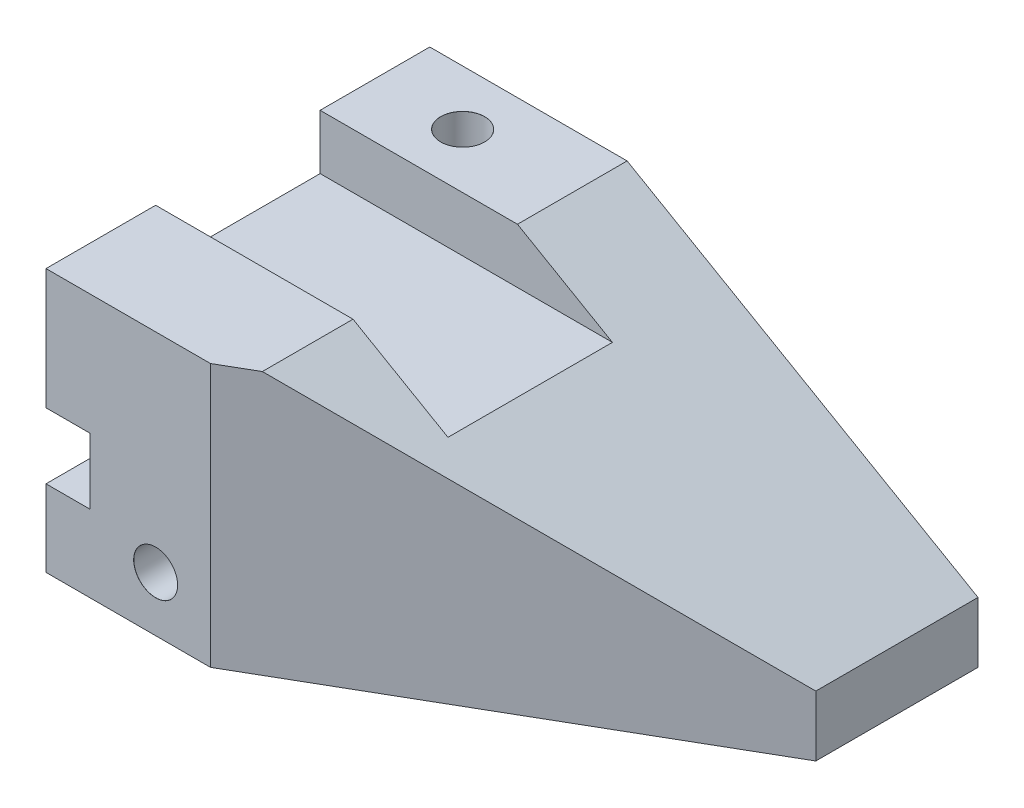
ISO-10303-21;
HEADER;
FILE_DESCRIPTION(('STEP AP214'),'2;1');
FILE_NAME('part.step','',(''),(''),'','','');
FILE_SCHEMA(('AUTOMOTIVE_DESIGN { 1 0 10303 214 1 1 1 1 }'));
ENDSEC;
DATA;
#1=APPLICATION_CONTEXT('core data for automotive mechanical design processes');
#2=APPLICATION_PROTOCOL_DEFINITION('international standard','automotive_design',2000,#1);
#3=PRODUCT_CONTEXT('',#1,'mechanical');
#4=PRODUCT('Part','Part','',(#3));
#5=PRODUCT_RELATED_PRODUCT_CATEGORY('part','',(#4));
#6=PRODUCT_DEFINITION_FORMATION('','',#4);
#7=PRODUCT_DEFINITION_CONTEXT('part definition',#1,'design');
#8=PRODUCT_DEFINITION('design','',#6,#7);
#9=PRODUCT_DEFINITION_SHAPE('','',#8);
#10=(LENGTH_UNIT() NAMED_UNIT(*) SI_UNIT(.MILLI.,.METRE.));
#11=(NAMED_UNIT(*) PLANE_ANGLE_UNIT() SI_UNIT($,.RADIAN.));
#12=(NAMED_UNIT(*) SI_UNIT($,.STERADIAN.) SOLID_ANGLE_UNIT());
#13=UNCERTAINTY_MEASURE_WITH_UNIT(LENGTH_MEASURE(1.E-05),#10,'distance_accuracy_value','');
#14=(GEOMETRIC_REPRESENTATION_CONTEXT(3) GLOBAL_UNCERTAINTY_ASSIGNED_CONTEXT((#13)) GLOBAL_UNIT_ASSIGNED_CONTEXT((#10,
#11,#12)) REPRESENTATION_CONTEXT('',''));
#15=CARTESIAN_POINT('',(0.,0.,0.));
#16=DIRECTION('',(0.,0.,1.));
#17=DIRECTION('',(1.,0.,0.));
#18=AXIS2_PLACEMENT_3D('',#15,#16,#17);
#19=CARTESIAN_POINT('',(0.,120.,0.));
#20=DIRECTION('',(1.,0.,0.));
#21=DIRECTION('',(0.,0.,-1.));
#22=AXIS2_PLACEMENT_3D('',#19,#20,#21);
#23=PLANE('',#22);
#24=DIRECTION('',(0.,-1.,0.));
#25=VECTOR('',#24,1.);
#26=CARTESIAN_POINT('',(0.,120.,-175.));
#27=LINE('',#26,#25);
#28=CARTESIAN_POINT('',(0.,120.,-175.));
#29=VERTEX_POINT('',#28);
#30=CARTESIAN_POINT('',(0.,65.,-175.));
#31=VERTEX_POINT('',#30);
#32=EDGE_CURVE('E176',#29,#31,#27,.T.);
#33=ORIENTED_EDGE('',*,*,#32,.T.);
#34=DIRECTION('',(0.,0.,1.));
#35=VECTOR('',#34,1.);
#36=CARTESIAN_POINT('',(0.,65.,-175.001));
#37=LINE('',#36,#35);
#38=CARTESIAN_POINT('',(0.,65.,0.));
#39=VERTEX_POINT('',#38);
#40=EDGE_CURVE('E224',#31,#39,#37,.T.);
#41=ORIENTED_EDGE('',*,*,#40,.T.);
#42=DIRECTION('',(0.,-1.,0.));
#43=VECTOR('',#42,1.);
#44=CARTESIAN_POINT('',(0.,120.,0.));
#45=LINE('',#44,#43);
#46=CARTESIAN_POINT('',(0.,120.,0.));
#47=VERTEX_POINT('',#46);
#48=EDGE_CURVE('E11',#47,#39,#45,.T.);
#49=ORIENTED_EDGE('',*,*,#48,.F.);
#50=DIRECTION('',(0.,0.,1.));
#51=VECTOR('',#50,1.);
#52=CARTESIAN_POINT('',(0.,120.,0.));
#53=LINE('',#52,#51);
#54=CARTESIAN_POINT('',(0.,120.,-50.));
#55=VERTEX_POINT('',#54);
#56=EDGE_CURVE('E175',#55,#47,#53,.T.);
#57=ORIENTED_EDGE('',*,*,#56,.F.);
#58=DIRECTION('',(0.,1.,0.));
#59=VECTOR('',#58,1.);
#60=CARTESIAN_POINT('',(0.,95.,-50.));
#61=LINE('',#60,#59);
#62=CARTESIAN_POINT('',(0.,95.,-50.));
#63=VERTEX_POINT('',#62);
#64=EDGE_CURVE('E205',#63,#55,#61,.T.);
#65=ORIENTED_EDGE('',*,*,#64,.F.);
#66=DIRECTION('',(0.,0.,1.));
#67=VECTOR('',#66,1.);
#68=CARTESIAN_POINT('',(0.,95.,-125.));
#69=LINE('',#68,#67);
#70=CARTESIAN_POINT('',(0.,95.,-125.));
#71=VERTEX_POINT('',#70);
#72=EDGE_CURVE('E212',#71,#63,#69,.T.);
#73=ORIENTED_EDGE('',*,*,#72,.F.);
#74=DIRECTION('',(0.,1.,0.));
#75=VECTOR('',#74,1.);
#76=CARTESIAN_POINT('',(0.,95.,-125.));
#77=LINE('',#76,#75);
#78=CARTESIAN_POINT('',(0.,120.,-125.));
#79=VERTEX_POINT('',#78);
#80=EDGE_CURVE('E169',#71,#79,#77,.T.);
#81=ORIENTED_EDGE('',*,*,#80,.T.);
#82=EDGE_CURVE('E201',#29,#79,#53,.T.);
#83=ORIENTED_EDGE('',*,*,#82,.F.);
#84=EDGE_LOOP('',(#33,#41,#49,#57,#65,#73,#81,#83));
#85=FACE_BOUND('',#84,.T.);
#86=ADVANCED_FACE('F33',(#85),#23,.F.);
#87=CARTESIAN_POINT('',(0.,120.,0.));
#88=DIRECTION('',(0.,-1.,0.));
#89=DIRECTION('',(0.,0.,-1.));
#90=AXIS2_PLACEMENT_3D('',#87,#88,#89);
#91=PLANE('',#90);
#92=CARTESIAN_POINT('',(40.,120.,-150.));
#93=DIRECTION('',(0.,1.,0.));
#94=DIRECTION('',(0.,0.,1.));
#95=AXIS2_PLACEMENT_3D('',#92,#93,#94);
#96=CIRCLE('',#95,10.025);
#97=CARTESIAN_POINT('',(40.,120.,-139.975));
#98=VERTEX_POINT('',#97);
#99=EDGE_CURVE('E260',#98,#98,#96,.T.);
#100=ORIENTED_EDGE('',*,*,#99,.F.);
#101=EDGE_LOOP('',(#100));
#102=FACE_BOUND('',#101,.T.);
#103=DIRECTION('',(-1.,0.,0.));
#104=VECTOR('',#103,1.);
#105=CARTESIAN_POINT('',(0.,120.,-125.));
#106=LINE('',#105,#104);
#107=CARTESIAN_POINT('',(90.,120.,-125.));
#108=VERTEX_POINT('',#107);
#109=EDGE_CURVE('E210',#108,#79,#106,.T.);
#110=ORIENTED_EDGE('',*,*,#109,.F.);
#111=DIRECTION('',(0.,0.,1.));
#112=VECTOR('',#111,1.);
#113=CARTESIAN_POINT('',(90.,120.,-175.001));
#114=LINE('',#113,#112);
#115=CARTESIAN_POINT('',(90.,120.,-175.));
#116=VERTEX_POINT('',#115);
#117=EDGE_CURVE('E272',#116,#108,#114,.T.);
#118=ORIENTED_EDGE('',*,*,#117,.F.);
#119=DIRECTION('',(-1.,0.,0.));
#120=VECTOR('',#119,1.);
#121=CARTESIAN_POINT('',(0.,120.,-175.));
#122=LINE('',#121,#120);
#123=EDGE_CURVE('E195',#116,#29,#122,.T.);
#124=ORIENTED_EDGE('',*,*,#123,.T.);
#125=ORIENTED_EDGE('',*,*,#82,.T.);
#126=EDGE_LOOP('',(#110,#118,#124,#125));
#127=FACE_BOUND('',#126,.T.);
#128=ADVANCED_FACE('F317',(#102,#127),#91,.F.);
#129=CARTESIAN_POINT('',(0.,35.,0.));
#130=VERTEX_POINT('',#129);
#131=CARTESIAN_POINT('',(0.,0.,0.));
#132=VERTEX_POINT('',#131);
#133=EDGE_CURVE('E47',#130,#132,#45,.T.);
#134=ORIENTED_EDGE('',*,*,#133,.F.);
#135=DIRECTION('',(0.,0.,1.));
#136=VECTOR('',#135,1.);
#137=CARTESIAN_POINT('',(0.,35.,-175.001));
#138=LINE('',#137,#136);
#139=CARTESIAN_POINT('',(0.,35.,-175.));
#140=VERTEX_POINT('',#139);
#141=EDGE_CURVE('E193',#140,#130,#138,.T.);
#142=ORIENTED_EDGE('',*,*,#141,.F.);
#143=CARTESIAN_POINT('',(0.,0.,-175.));
#144=VERTEX_POINT('',#143);
#145=EDGE_CURVE('E180',#140,#144,#27,.T.);
#146=ORIENTED_EDGE('',*,*,#145,.T.);
#147=DIRECTION('',(0.,0.,1.));
#148=VECTOR('',#147,1.);
#149=CARTESIAN_POINT('',(0.,0.,0.));
#150=LINE('',#149,#148);
#151=EDGE_CURVE('E165',#144,#132,#150,.T.);
#152=ORIENTED_EDGE('',*,*,#151,.T.);
#153=EDGE_LOOP('',(#134,#142,#146,#152));
#154=FACE_BOUND('',#153,.T.);
#155=ADVANCED_FACE('F35',(#154),#23,.F.);
#156=CARTESIAN_POINT('',(0.,120.,0.));
#157=DIRECTION('',(0.,0.,-1.));
#158=DIRECTION('',(-1.,0.,0.));
#159=AXIS2_PLACEMENT_3D('',#156,#157,#158);
#160=PLANE('',#159);
#161=CARTESIAN_POINT('',(50.,25.,0.));
#162=DIRECTION('',(0.,0.,1.));
#163=DIRECTION('',(1.,0.,0.));
#164=AXIS2_PLACEMENT_3D('',#161,#162,#163);
#165=CIRCLE('',#164,10.025);
#166=CARTESIAN_POINT('',(60.025,25.,0.));
#167=VERTEX_POINT('',#166);
#168=EDGE_CURVE('E251',#167,#167,#165,.T.);
#169=ORIENTED_EDGE('',*,*,#168,.F.);
#170=EDGE_LOOP('',(#169));
#171=FACE_BOUND('',#170,.T.);
#172=DIRECTION('',(1.,0.,0.));
#173=VECTOR('',#172,1.);
#174=CARTESIAN_POINT('',(0.,0.,0.));
#175=LINE('',#174,#173);
#176=CARTESIAN_POINT('',(75.,0.,0.));
#177=VERTEX_POINT('',#176);
#178=EDGE_CURVE('E156',#132,#177,#175,.T.);
#179=ORIENTED_EDGE('',*,*,#178,.T.);
#180=DIRECTION('',(0.,1.,0.));
#181=VECTOR('',#180,1.);
#182=CARTESIAN_POINT('',(75.,-0.001000000000001,0.));
#183=LINE('',#182,#181);
#184=CARTESIAN_POINT('',(75.,120.,0.));
#185=VERTEX_POINT('',#184);
#186=EDGE_CURVE('E138',#177,#185,#183,.T.);
#187=ORIENTED_EDGE('',*,*,#186,.T.);
#188=DIRECTION('',(1.,0.,0.));
#189=VECTOR('',#188,1.);
#190=CARTESIAN_POINT('',(0.,120.,0.));
#191=LINE('',#190,#189);
#192=EDGE_CURVE('E196',#47,#185,#191,.T.);
#193=ORIENTED_EDGE('',*,*,#192,.F.);
#194=ORIENTED_EDGE('',*,*,#48,.T.);
#195=DIRECTION('',(-1.,0.,0.));
#196=VECTOR('',#195,1.);
#197=CARTESIAN_POINT('',(0.,65.,0.));
#198=LINE('',#197,#196);
#199=CARTESIAN_POINT('',(20.,65.,0.));
#200=VERTEX_POINT('',#199);
#201=EDGE_CURVE('E227',#200,#39,#198,.T.);
#202=ORIENTED_EDGE('',*,*,#201,.F.);
#203=DIRECTION('',(0.,1.,0.));
#204=VECTOR('',#203,1.);
#205=CARTESIAN_POINT('',(20.,35.,0.));
#206=LINE('',#205,#204);
#207=CARTESIAN_POINT('',(20.,35.,0.));
#208=VERTEX_POINT('',#207);
#209=EDGE_CURVE('E234',#208,#200,#206,.T.);
#210=ORIENTED_EDGE('',*,*,#209,.F.);
#211=DIRECTION('',(1.,0.,0.));
#212=VECTOR('',#211,1.);
#213=CARTESIAN_POINT('',(0.,35.,0.));
#214=LINE('',#213,#212);
#215=EDGE_CURVE('E237',#130,#208,#214,.T.);
#216=ORIENTED_EDGE('',*,*,#215,.F.);
#217=ORIENTED_EDGE('',*,*,#133,.T.);
#218=EDGE_LOOP('',(#179,#187,#193,#194,#202,#210,#216,#217));
#219=FACE_BOUND('',#218,.T.);
#220=ADVANCED_FACE('F162',(#171,#219),#160,.F.);
#221=CARTESIAN_POINT('',(250.,120.,0.));
#222=DIRECTION('',(-1.,0.,0.));
#223=DIRECTION('',(0.,0.,1.));
#224=AXIS2_PLACEMENT_3D('',#221,#222,#223);
#225=PLANE('',#224);
#226=DIRECTION('',(0.,0.,1.));
#227=VECTOR('',#226,1.);
#228=CARTESIAN_POINT('',(250.,27.6239569296596,-175.001));
#229=LINE('',#228,#227);
#230=CARTESIAN_POINT('',(250.,27.6239569296596,-175.));
#231=VERTEX_POINT('',#230);
#232=CARTESIAN_POINT('',(250.,27.6239569296596,-101.036297108185));
#233=VERTEX_POINT('',#232);
#234=EDGE_CURVE('E269',#231,#233,#229,.T.);
#235=ORIENTED_EDGE('',*,*,#234,.T.);
#236=DIRECTION('',(0.,1.,0.));
#237=VECTOR('',#236,1.);
#238=CARTESIAN_POINT('',(250.,-0.001000000000001,-101.036297108185));
#239=LINE('',#238,#237);
#240=CARTESIAN_POINT('',(250.,0.,-101.036297108185));
#241=VERTEX_POINT('',#240);
#242=EDGE_CURVE('E54',#241,#233,#239,.T.);
#243=ORIENTED_EDGE('',*,*,#242,.F.);
#244=DIRECTION('',(0.,0.,-1.));
#245=VECTOR('',#244,1.);
#246=CARTESIAN_POINT('',(250.,0.,0.));
#247=LINE('',#246,#245);
#248=CARTESIAN_POINT('',(250.,0.,-175.));
#249=VERTEX_POINT('',#248);
#250=EDGE_CURVE('E159',#241,#249,#247,.T.);
#251=ORIENTED_EDGE('',*,*,#250,.T.);
#252=DIRECTION('',(0.,-1.,0.));
#253=VECTOR('',#252,1.);
#254=CARTESIAN_POINT('',(250.,120.,-175.));
#255=LINE('',#254,#253);
#256=EDGE_CURVE('E179',#231,#249,#255,.T.);
#257=ORIENTED_EDGE('',*,*,#256,.F.);
#258=EDGE_LOOP('',(#235,#243,#251,#257));
#259=FACE_BOUND('',#258,.T.);
#260=ADVANCED_FACE('F327',(#259),#225,.F.);
#261=CARTESIAN_POINT('',(0.,120.,-175.));
#262=DIRECTION('',(0.,0.,1.));
#263=DIRECTION('',(1.,0.,0.));
#264=AXIS2_PLACEMENT_3D('',#261,#262,#263);
#265=PLANE('',#264);
#266=CARTESIAN_POINT('',(50.,25.,-175.));
#267=DIRECTION('',(0.,0.,1.));
#268=DIRECTION('',(1.,0.,0.));
#269=AXIS2_PLACEMENT_3D('',#266,#267,#268);
#270=CIRCLE('',#269,9.99999999999995);
#271=CARTESIAN_POINT('',(60.,25.,-175.));
#272=VERTEX_POINT('',#271);
#273=EDGE_CURVE('E245',#272,#272,#270,.T.);
#274=ORIENTED_EDGE('',*,*,#273,.T.);
#275=EDGE_LOOP('',(#274));
#276=FACE_BOUND('',#275,.T.);
#277=ORIENTED_EDGE('',*,*,#123,.F.);
#278=DIRECTION('',(-0.866025403784438,0.500000000000001,0.));
#279=VECTOR('',#278,1.);
#280=CARTESIAN_POINT('',(90.,120.,-175.));
#281=LINE('',#280,#279);
#282=EDGE_CURVE('E188',#231,#116,#281,.T.);
#283=ORIENTED_EDGE('',*,*,#282,.F.);
#284=ORIENTED_EDGE('',*,*,#256,.T.);
#285=DIRECTION('',(-1.,0.,0.));
#286=VECTOR('',#285,1.);
#287=CARTESIAN_POINT('',(0.,0.,-175.));
#288=LINE('',#287,#286);
#289=EDGE_CURVE('E167',#249,#144,#288,.T.);
#290=ORIENTED_EDGE('',*,*,#289,.T.);
#291=ORIENTED_EDGE('',*,*,#145,.F.);
#292=DIRECTION('',(-1.,0.,0.));
#293=VECTOR('',#292,1.);
#294=CARTESIAN_POINT('',(0.,35.,-175.));
#295=LINE('',#294,#293);
#296=CARTESIAN_POINT('',(20.,35.,-175.));
#297=VERTEX_POINT('',#296);
#298=EDGE_CURVE('E216',#297,#140,#295,.T.);
#299=ORIENTED_EDGE('',*,*,#298,.F.);
#300=DIRECTION('',(0.,-1.,0.));
#301=VECTOR('',#300,1.);
#302=CARTESIAN_POINT('',(20.,35.,-175.));
#303=LINE('',#302,#301);
#304=CARTESIAN_POINT('',(20.,65.,-175.));
#305=VERTEX_POINT('',#304);
#306=EDGE_CURVE('E243',#305,#297,#303,.T.);
#307=ORIENTED_EDGE('',*,*,#306,.F.);
#308=DIRECTION('',(1.,0.,0.));
#309=VECTOR('',#308,1.);
#310=CARTESIAN_POINT('',(0.,65.,-175.));
#311=LINE('',#310,#309);
#312=EDGE_CURVE('E240',#31,#305,#311,.T.);
#313=ORIENTED_EDGE('',*,*,#312,.F.);
#314=ORIENTED_EDGE('',*,*,#32,.F.);
#315=EDGE_LOOP('',(#277,#283,#284,#290,#291,#299,#307,#313,#314));
#316=FACE_BOUND('',#315,.T.);
#317=ADVANCED_FACE('F186',(#276,#316),#265,.F.);
#318=ORIENTED_EDGE('',*,*,#192,.T.);
#319=DIRECTION('',(-0.866025403784438,0.,0.500000000000001));
#320=VECTOR('',#319,1.);
#321=CARTESIAN_POINT('',(75.,120.,0.));
#322=LINE('',#321,#320);
#323=CARTESIAN_POINT('',(90.,120.,-8.66025403784441));
#324=VERTEX_POINT('',#323);
#325=EDGE_CURVE('E143',#324,#185,#322,.T.);
#326=ORIENTED_EDGE('',*,*,#325,.F.);
#327=CARTESIAN_POINT('',(90.,120.,-50.));
#328=VERTEX_POINT('',#327);
#329=EDGE_CURVE('E148',#328,#324,#114,.T.);
#330=ORIENTED_EDGE('',*,*,#329,.F.);
#331=DIRECTION('',(1.,0.,0.));
#332=VECTOR('',#331,1.);
#333=CARTESIAN_POINT('',(0.,120.,-50.));
#334=LINE('',#333,#332);
#335=EDGE_CURVE('E213',#55,#328,#334,.T.);
#336=ORIENTED_EDGE('',*,*,#335,.F.);
#337=ORIENTED_EDGE('',*,*,#56,.T.);
#338=EDGE_LOOP('',(#318,#326,#330,#336,#337));
#339=FACE_BOUND('',#338,.T.);
#340=ADVANCED_FACE('F278',(#339),#91,.F.);
#341=CARTESIAN_POINT('',(0.,0.,0.));
#342=DIRECTION('',(0.,-1.,0.));
#343=DIRECTION('',(0.,0.,-1.));
#344=AXIS2_PLACEMENT_3D('',#341,#342,#343);
#345=PLANE('',#344);
#346=DIRECTION('',(-0.866025403784438,0.,0.500000000000001));
#347=VECTOR('',#346,1.);
#348=CARTESIAN_POINT('',(75.,0.,0.));
#349=LINE('',#348,#347);
#350=EDGE_CURVE('E141',#241,#177,#349,.T.);
#351=ORIENTED_EDGE('',*,*,#350,.T.);
#352=ORIENTED_EDGE('',*,*,#178,.F.);
#353=ORIENTED_EDGE('',*,*,#151,.F.);
#354=ORIENTED_EDGE('',*,*,#289,.F.);
#355=ORIENTED_EDGE('',*,*,#250,.F.);
#356=EDGE_LOOP('',(#351,#352,#353,#354,#355));
#357=FACE_BOUND('',#356,.T.);
#358=CARTESIAN_POINT('',(40.,0.,-150.));
#359=DIRECTION('',(0.,1.,0.));
#360=DIRECTION('',(0.,0.,1.));
#361=AXIS2_PLACEMENT_3D('',#358,#359,#360);
#362=CIRCLE('',#361,9.99999999999999);
#363=CARTESIAN_POINT('',(40.,0.,-140.));
#364=VERTEX_POINT('',#363);
#365=EDGE_CURVE('E254',#364,#364,#362,.T.);
#366=ORIENTED_EDGE('',*,*,#365,.T.);
#367=EDGE_LOOP('',(#366));
#368=FACE_BOUND('',#367,.T.);
#369=ADVANCED_FACE('F153',(#357,#368),#345,.T.);
#370=CARTESIAN_POINT('',(0.,95.,-125.));
#371=DIRECTION('',(0.,0.,-1.));
#372=DIRECTION('',(-1.,0.,0.));
#373=AXIS2_PLACEMENT_3D('',#370,#371,#372);
#374=PLANE('',#373);
#375=DIRECTION('',(-1.,0.,0.));
#376=VECTOR('',#375,1.);
#377=CARTESIAN_POINT('',(0.,95.,-125.));
#378=LINE('',#377,#376);
#379=CARTESIAN_POINT('',(133.301270189222,95.,-125.));
#380=VERTEX_POINT('',#379);
#381=EDGE_CURVE('E207',#380,#71,#378,.T.);
#382=ORIENTED_EDGE('',*,*,#381,.F.);
#383=DIRECTION('',(0.866025403784438,-0.500000000000001,0.));
#384=VECTOR('',#383,1.);
#385=CARTESIAN_POINT('',(90.,120.,-125.));
#386=LINE('',#385,#384);
#387=EDGE_CURVE('E62',#108,#380,#386,.T.);
#388=ORIENTED_EDGE('',*,*,#387,.F.);
#389=ORIENTED_EDGE('',*,*,#109,.T.);
#390=ORIENTED_EDGE('',*,*,#80,.F.);
#391=EDGE_LOOP('',(#382,#388,#389,#390));
#392=FACE_BOUND('',#391,.T.);
#393=ADVANCED_FACE('F339',(#392),#374,.F.);
#394=CARTESIAN_POINT('',(0.,95.,-50.));
#395=DIRECTION('',(0.,0.,1.));
#396=DIRECTION('',(1.,0.,0.));
#397=AXIS2_PLACEMENT_3D('',#394,#395,#396);
#398=PLANE('',#397);
#399=ORIENTED_EDGE('',*,*,#335,.T.);
#400=DIRECTION('',(-0.866025403784438,0.500000000000001,0.));
#401=VECTOR('',#400,1.);
#402=CARTESIAN_POINT('',(90.,120.,-50.));
#403=LINE('',#402,#401);
#404=CARTESIAN_POINT('',(133.301270189222,95.,-50.));
#405=VERTEX_POINT('',#404);
#406=EDGE_CURVE('E265',#405,#328,#403,.T.);
#407=ORIENTED_EDGE('',*,*,#406,.F.);
#408=DIRECTION('',(1.,0.,0.));
#409=VECTOR('',#408,1.);
#410=CARTESIAN_POINT('',(0.,95.,-50.));
#411=LINE('',#410,#409);
#412=EDGE_CURVE('E218',#63,#405,#411,.T.);
#413=ORIENTED_EDGE('',*,*,#412,.F.);
#414=ORIENTED_EDGE('',*,*,#64,.T.);
#415=EDGE_LOOP('',(#399,#407,#413,#414));
#416=FACE_BOUND('',#415,.T.);
#417=ADVANCED_FACE('F283',(#416),#398,.F.);
#418=CARTESIAN_POINT('',(0.,95.,0.));
#419=DIRECTION('',(0.,1.,0.));
#420=DIRECTION('',(0.,0.,1.));
#421=AXIS2_PLACEMENT_3D('',#418,#419,#420);
#422=PLANE('',#421);
#423=DIRECTION('',(0.,0.,-1.));
#424=VECTOR('',#423,1.);
#425=CARTESIAN_POINT('',(133.301270189222,95.,-175.001));
#426=LINE('',#425,#424);
#427=EDGE_CURVE('E267',#405,#380,#426,.T.);
#428=ORIENTED_EDGE('',*,*,#427,.T.);
#429=ORIENTED_EDGE('',*,*,#381,.T.);
#430=ORIENTED_EDGE('',*,*,#72,.T.);
#431=ORIENTED_EDGE('',*,*,#412,.T.);
#432=EDGE_LOOP('',(#428,#429,#430,#431));
#433=FACE_BOUND('',#432,.T.);
#434=ADVANCED_FACE('F285',(#433),#422,.T.);
#435=CARTESIAN_POINT('',(0.,65.,-175.001));
#436=DIRECTION('',(0.,1.,0.));
#437=DIRECTION('',(0.,0.,1.));
#438=AXIS2_PLACEMENT_3D('',#435,#436,#437);
#439=PLANE('',#438);
#440=ORIENTED_EDGE('',*,*,#312,.T.);
#441=DIRECTION('',(0.,0.,1.));
#442=VECTOR('',#441,1.);
#443=CARTESIAN_POINT('',(20.,65.,-175.001));
#444=LINE('',#443,#442);
#445=EDGE_CURVE('E229',#305,#200,#444,.T.);
#446=ORIENTED_EDGE('',*,*,#445,.T.);
#447=ORIENTED_EDGE('',*,*,#201,.T.);
#448=ORIENTED_EDGE('',*,*,#40,.F.);
#449=EDGE_LOOP('',(#440,#446,#447,#448));
#450=FACE_BOUND('',#449,.T.);
#451=ADVANCED_FACE('F297',(#450),#439,.F.);
#452=CARTESIAN_POINT('',(20.,35.,-175.001));
#453=DIRECTION('',(1.,0.,0.));
#454=DIRECTION('',(0.,0.,-1.));
#455=AXIS2_PLACEMENT_3D('',#452,#453,#454);
#456=PLANE('',#455);
#457=ORIENTED_EDGE('',*,*,#306,.T.);
#458=DIRECTION('',(0.,0.,1.));
#459=VECTOR('',#458,1.);
#460=CARTESIAN_POINT('',(20.,35.,-175.001));
#461=LINE('',#460,#459);
#462=EDGE_CURVE('E226',#297,#208,#461,.T.);
#463=ORIENTED_EDGE('',*,*,#462,.T.);
#464=ORIENTED_EDGE('',*,*,#209,.T.);
#465=ORIENTED_EDGE('',*,*,#445,.F.);
#466=EDGE_LOOP('',(#457,#463,#464,#465));
#467=FACE_BOUND('',#466,.T.);
#468=ADVANCED_FACE('F301',(#467),#456,.F.);
#469=CARTESIAN_POINT('',(0.,35.,-175.001));
#470=DIRECTION('',(0.,-1.,0.));
#471=DIRECTION('',(0.,0.,-1.));
#472=AXIS2_PLACEMENT_3D('',#469,#470,#471);
#473=PLANE('',#472);
#474=ORIENTED_EDGE('',*,*,#298,.T.);
#475=ORIENTED_EDGE('',*,*,#141,.T.);
#476=ORIENTED_EDGE('',*,*,#215,.T.);
#477=ORIENTED_EDGE('',*,*,#462,.F.);
#478=EDGE_LOOP('',(#474,#475,#476,#477));
#479=FACE_BOUND('',#478,.T.);
#480=ADVANCED_FACE('F303',(#479),#473,.F.);
#481=CARTESIAN_POINT('',(50.,25.,0.));
#482=DIRECTION('',(0.,0.,1.));
#483=DIRECTION('',(1.,0.,0.));
#484=AXIS2_PLACEMENT_3D('',#481,#482,#483);
#485=CYLINDRICAL_SURFACE('',#484,9.99999999999997);
#486=CARTESIAN_POINT('',(40.,25.,-140.));
#487=CARTESIAN_POINT('',(40.0000011164459,25.2784733117109,-139.999998314663));
#488=CARTESIAN_POINT('',(40.0116403564846,25.5569709318093,-139.999979224375));
#489=CARTESIAN_POINT('',(40.0581217209358,26.1120456510113,-140.000142444646));
#490=CARTESIAN_POINT('',(40.0929667877922,26.3886225020718,-140.000324780747));
#491=CARTESIAN_POINT('',(40.1856528956024,26.9381113981929,-140.001616036622));
#492=CARTESIAN_POINT('',(40.2435111394079,27.2110205434357,-140.002725650241));
#493=CARTESIAN_POINT('',(40.3818138239537,27.7510321794495,-140.007052522797));
#494=CARTESIAN_POINT('',(40.4622576639304,28.0181348244665,-140.010269725678));
#495=CARTESIAN_POINT('',(40.645268345221,28.5449762233505,-140.020419166021));
#496=CARTESIAN_POINT('',(40.7478638321738,28.8047049447802,-140.02735623126));
#497=CARTESIAN_POINT('',(40.9743283934105,29.3145156435057,-140.046930382791));
#498=CARTESIAN_POINT('',(41.0981979458323,29.56459740383,-140.059567597206));
#499=CARTESIAN_POINT('',(41.3661237326018,30.053093890003,-140.092835099111));
#500=CARTESIAN_POINT('',(41.5101752813542,30.2915113066431,-140.113463533261));
#501=CARTESIAN_POINT('',(41.817077985024,30.7547331392921,-140.165243767998));
#502=CARTESIAN_POINT('',(41.9799279402998,30.9795384225804,-140.196394897313));
#503=CARTESIAN_POINT('',(42.3158521534596,31.4050323927945,-140.270394366054));
#504=CARTESIAN_POINT('',(42.4882772324727,31.6063204798161,-140.312737448348));
#505=CARTESIAN_POINT('',(42.8465993621831,31.9927293218071,-140.411913223387));
#506=CARTESIAN_POINT('',(43.0324961017726,32.1778504499104,-140.468745581602));
#507=CARTESIAN_POINT('',(43.4147726370236,32.5300887496309,-140.598934805331));
#508=CARTESIAN_POINT('',(43.6111376626287,32.6972303336845,-140.672268835534));
#509=CARTESIAN_POINT('',(44.0112941604236,33.0125056933578,-140.83723270861));
#510=CARTESIAN_POINT('',(44.2150843338814,33.1606427727556,-140.928859364362));
#511=CARTESIAN_POINT('',(44.5983287925195,33.4183016581184,-141.117736568206));
#512=CARTESIAN_POINT('',(44.7773171803953,33.5303348536523,-141.212521380392));
#513=CARTESIAN_POINT('',(45.1354935725863,33.7395410317952,-141.416923562821));
#514=CARTESIAN_POINT('',(45.3146815548079,33.8367155208376,-141.526539427309));
#515=CARTESIAN_POINT('',(45.67070223909,34.016482922516,-141.76055110423));
#516=CARTESIAN_POINT('',(45.8475348608862,34.0990753394044,-141.884947418915));
#517=CARTESIAN_POINT('',(46.1963977333386,34.2503385869726,-142.148096463311));
#518=CARTESIAN_POINT('',(46.3684279560745,34.3190093367289,-142.286849276466));
#519=CARTESIAN_POINT('',(46.695666478232,34.4398104820681,-142.56951833203));
#520=CARTESIAN_POINT('',(46.8512714674933,34.4926699501665,-142.712666493169));
#521=CARTESIAN_POINT('',(47.1546328332291,34.5879698910169,-143.010266415895));
#522=CARTESIAN_POINT('',(47.3023896268452,34.6304109179575,-143.164717575674));
#523=CARTESIAN_POINT('',(47.5887239914908,34.7060644574294,-143.484075167693));
#524=CARTESIAN_POINT('',(47.7272997433041,34.7392751451169,-143.648983659452));
#525=CARTESIAN_POINT('',(47.9941295174867,34.7977111229284,-143.988303774098));
#526=CARTESIAN_POINT('',(48.1223823159058,34.8229354671814,-144.162716519766));
#527=CARTESIAN_POINT('',(48.3797789693295,34.8688211234124,-144.537764400118));
#528=CARTESIAN_POINT('',(48.5077554405053,34.8887840203787,-144.739286608896));
#529=CARTESIAN_POINT('',(48.7491622061604,34.9222103818547,-145.151371506613));
#530=CARTESIAN_POINT('',(48.8625917781589,34.9356735236419,-145.361934643883));
#531=CARTESIAN_POINT('',(49.0742000077211,34.9576211223176,-145.790947156375));
#532=CARTESIAN_POINT('',(49.1723720203242,34.9661034143934,-146.009399916921));
#533=CARTESIAN_POINT('',(49.3528214926984,34.9794461100272,-146.452881243395));
#534=CARTESIAN_POINT('',(49.4350981574848,34.9843063324669,-146.677910137572));
#535=CARTESIAN_POINT('',(49.5925703921443,34.9920462374302,-147.161836277882));
#536=CARTESIAN_POINT('',(49.6655923719516,34.9946020786554,-147.421448657582));
#537=CARTESIAN_POINT('',(49.7904369883785,34.9979989513716,-147.945742094054));
#538=CARTESIAN_POINT('',(49.8422580645708,34.9988398566582,-148.210423522417));
#539=CARTESIAN_POINT('',(49.9243615242223,34.9997984366051,-148.743144132673));
#540=CARTESIAN_POINT('',(49.9546411665104,34.9999160192364,-149.011183737483));
#541=CARTESIAN_POINT('',(49.9934525043353,35.0000166239864,-149.548830533699));
#542=CARTESIAN_POINT('',(50.0019841162023,34.9999996455873,-149.818437731131));
#543=CARTESIAN_POINT('',(49.9971441228787,35.0000003538127,-150.368628162888));
#544=CARTESIAN_POINT('',(49.9828511699966,35.0000195045604,-150.649203743483));
#545=CARTESIAN_POINT('',(49.9307164812398,34.9997937308488,-151.208166278887));
#546=CARTESIAN_POINT('',(49.8928738393782,34.9995487962295,-151.486553149078));
#547=CARTESIAN_POINT('',(49.7938892920078,34.9979981198865,-152.039259866146));
#548=CARTESIAN_POINT('',(49.7327386971543,34.9966919823341,-152.31357815656));
#549=CARTESIAN_POINT('',(49.5875781166205,34.9917554503103,-152.85607929973));
#550=CARTESIAN_POINT('',(49.5035682450202,34.988125067438,-153.124262183098));
#551=CARTESIAN_POINT('',(49.3132176235734,34.9768443619666,-153.652799838343));
#552=CARTESIAN_POINT('',(49.2068552128686,34.9691901291496,-153.913146734883));
#553=CARTESIAN_POINT('',(48.9726868020494,34.947785864341,-154.423774287147));
#554=CARTESIAN_POINT('',(48.8448803855981,34.9340357139882,-154.674054747314));
#555=CARTESIAN_POINT('',(48.5689827853483,34.8980568711973,-155.162477644203));
#556=CARTESIAN_POINT('',(48.4208966257743,34.8758302763374,-155.400623067344));
#557=CARTESIAN_POINT('',(48.105920141358,34.8202860474798,-155.862783502148));
#558=CARTESIAN_POINT('',(47.9390312810137,34.7869692768751,-156.086799612192));
#559=CARTESIAN_POINT('',(47.5971951138057,34.7085380833616,-156.507876311757));
#560=CARTESIAN_POINT('',(47.4230647406767,34.6640948709423,-156.705724041904));
#561=CARTESIAN_POINT('',(47.0618562237645,34.5604702278818,-157.085108589065));
#562=CARTESIAN_POINT('',(46.8747785005289,34.5012892757801,-157.266645935422));
#563=CARTESIAN_POINT('',(46.4907253262363,34.366234691354,-157.611637150612));
#564=CARTESIAN_POINT('',(46.293763903659,34.2903842292312,-157.775115651453));
#565=CARTESIAN_POINT('',(45.8930364406199,34.1203167672392,-158.083065120081));
#566=CARTESIAN_POINT('',(45.6892715555972,34.0261028730345,-158.22753929501));
#567=CARTESIAN_POINT('',(45.3069347994945,33.8325839310942,-158.478285167542));
#568=CARTESIAN_POINT('',(45.1287523357141,33.735761170343,-158.587078190386));
#569=CARTESIAN_POINT('',(44.7726324372209,33.5274358250208,-158.789992321703));
#570=CARTESIAN_POINT('',(44.5946949791114,33.4159347569617,-158.88411494368));
#571=CARTESIAN_POINT('',(44.2415567036752,33.1783631646332,-159.058032536514));
#572=CARTESIAN_POINT('',(44.0663560989823,33.0522915146627,-159.137826399137));
#573=CARTESIAN_POINT('',(43.7210736500396,32.7860520813653,-159.283789651323));
#574=CARTESIAN_POINT('',(43.550991865561,32.6458841335219,-159.349958881847));
#575=CARTESIAN_POINT('',(43.2266374859397,32.3597495618668,-159.466624794271));
#576=CARTESIAN_POINT('',(43.0720014975421,32.214449480687,-159.51775142551));
#577=CARTESIAN_POINT('',(42.7708469207061,31.912654224294,-159.60974507462));
#578=CARTESIAN_POINT('',(42.6243279395343,31.7561595915592,-159.650612589207));
#579=CARTESIAN_POINT('',(42.3407026388801,31.4328394036547,-159.723299544356));
#580=CARTESIAN_POINT('',(42.2035982082615,31.2660117880501,-159.755117173217));
#581=CARTESIAN_POINT('',(41.939911532974,30.9229880345955,-159.810958749977));
#582=CARTESIAN_POINT('',(41.8133305356813,30.7467907901806,-159.834981774933));
#583=CARTESIAN_POINT('',(41.5590921257166,30.3673521767316,-159.878641116363));
#584=CARTESIAN_POINT('',(41.4326749134625,30.1631975782754,-159.897567691883));
#585=CARTESIAN_POINT('',(41.1946817404239,29.7459528984386,-159.929106184887));
#586=CARTESIAN_POINT('',(41.0831065572424,29.5328623496548,-159.941717771613));
#587=CARTESIAN_POINT('',(40.8754855416091,29.0989162014313,-159.962149115839));
#588=CARTESIAN_POINT('',(40.7794464666653,28.8780572736712,-159.969966792306));
#589=CARTESIAN_POINT('',(40.6035262313126,28.4299037577485,-159.98216057602));
#590=CARTESIAN_POINT('',(40.5236458411646,28.2026088633814,-159.986536519232));
#591=CARTESIAN_POINT('',(40.3716939899737,27.7145553188557,-159.993414640879));
#592=CARTESIAN_POINT('',(40.3017872724925,27.4531158879399,-159.99562060095));
#593=CARTESIAN_POINT('',(40.1833857635918,26.9254145242091,-159.998493711211));
#594=CARTESIAN_POINT('',(40.1348925326733,26.6591522414017,-159.999160749266));
#595=CARTESIAN_POINT('',(40.0596377566511,26.1235388193533,-159.999893177545));
#596=CARTESIAN_POINT('',(40.0328787913524,25.8541873172763,-159.999958496355));
#597=CARTESIAN_POINT('',(40.001278843765,25.3142041670616,-160.000012335035));
#598=CARTESIAN_POINT('',(39.9964379151906,25.0435725157883,-160.000000854717));
#599=CARTESIAN_POINT('',(40.0089411373327,24.4924888690362,-159.999998438262));
#600=CARTESIAN_POINT('',(40.0271381230518,24.2120558366669,-160.00000830205));
#601=CARTESIAN_POINT('',(40.0870620673378,23.653707547486,-159.999665653256));
#602=CARTESIAN_POINT('',(40.1287898927216,23.3757923838096,-159.999313127324));
#603=CARTESIAN_POINT('',(40.2355002442694,22.8243525944489,-159.997368914805));
#604=CARTESIAN_POINT('',(40.3004918237154,22.55082972142,-159.995776745518));
#605=CARTESIAN_POINT('',(40.4532588169231,22.0102470765762,-159.990014706736));
#606=CARTESIAN_POINT('',(40.5410341112164,21.7431872708798,-159.985844850758));
#607=CARTESIAN_POINT('',(40.7387509685807,21.2173842473949,-159.973166901996));
#608=CARTESIAN_POINT('',(40.8487008527489,20.95864419401,-159.964657178823));
#609=CARTESIAN_POINT('',(41.0898679523032,20.4515535271325,-159.941169882337));
#610=CARTESIAN_POINT('',(41.2210855786125,20.2032031144995,-159.926192184043));
#611=CARTESIAN_POINT('',(41.5035631638294,19.7189876512859,-159.887345845633));
#612=CARTESIAN_POINT('',(41.6548165698527,19.4831185537249,-159.863480107828));
#613=CARTESIAN_POINT('',(41.9758215825603,19.025841775843,-159.804220993676));
#614=CARTESIAN_POINT('',(42.1455716157262,18.8044328679448,-159.768828597399));
#615=CARTESIAN_POINT('',(42.4918319759684,18.3896756145236,-159.686108768744));
#616=CARTESIAN_POINT('',(42.6674777309813,18.1954568870162,-159.63953187178));
#617=CARTESIAN_POINT('',(43.0311645171927,17.8234427823239,-159.531422109052));
#618=CARTESIAN_POINT('',(43.2192050932105,17.6456468026142,-159.46988979228));
#619=CARTESIAN_POINT('',(43.6045862274016,17.3081734511068,-159.330000423647));
#620=CARTESIAN_POINT('',(43.8019139269299,17.1484720134314,-159.251666129693));
#621=CARTESIAN_POINT('',(44.2027435537032,16.8480359346258,-159.07660325553));
#622=CARTESIAN_POINT('',(44.4062444646534,16.7072981920438,-158.979877689408));
#623=CARTESIAN_POINT('',(44.7873852201812,16.4634572410911,-158.781827781312));
#624=CARTESIAN_POINT('',(44.9647143599583,16.3578408409513,-158.682984303294));
#625=CARTESIAN_POINT('',(45.3186956666387,16.1610871297801,-158.470775582797));
#626=CARTESIAN_POINT('',(45.4953479021709,16.0699483108617,-158.357411854874));
#627=CARTESIAN_POINT('',(45.8455462757124,15.9017437717225,-158.116328438314));
#628=CARTESIAN_POINT('',(46.0190920696661,15.8246796017535,-157.988607170766));
#629=CARTESIAN_POINT('',(46.3607620675747,15.6838797557088,-157.719327497464));
#630=CARTESIAN_POINT('',(46.5288861787305,15.6201443076691,-157.577768855031));
#631=CARTESIAN_POINT('',(46.8503514707571,15.5075064908511,-157.288168552854));
#632=CARTESIAN_POINT('',(47.0040175870948,15.4580716099002,-157.140692907456));
#633=CARTESIAN_POINT('',(47.3029644435197,15.3693034680561,-156.83465199618));
#634=CARTESIAN_POINT('',(47.4482455481953,15.3299697676968,-156.676087213133));
#635=CARTESIAN_POINT('',(47.7291627617078,15.2601716703668,-156.348745875953));
#636=CARTESIAN_POINT('',(47.8647968109674,15.2297091630623,-156.179967155367));
#637=CARTESIAN_POINT('',(48.1253383755597,15.1763891278439,-155.83317467843));
#638=CARTESIAN_POINT('',(48.2502447838565,15.1535323841067,-155.655159972008));
#639=CARTESIAN_POINT('',(48.501268829404,15.112043223362,-155.271291278649));
#640=CARTESIAN_POINT('',(48.6260746652388,15.0941285460765,-155.064501165536));
#641=CARTESIAN_POINT('',(48.8605491969965,15.0644264361672,-154.64209380398));
#642=CARTESIAN_POINT('',(48.970217060831,15.0526393402594,-154.426476071153));
#643=CARTESIAN_POINT('',(49.1737434744378,15.0336689481512,-153.987601186927));
#644=CARTESIAN_POINT('',(49.2675952062952,15.0264876336573,-153.764340790618));
#645=CARTESIAN_POINT('',(49.4388762966091,15.0153866019545,-153.311528337058));
#646=CARTESIAN_POINT('',(49.5163048742469,15.0114670397956,-153.081975981248));
#647=CARTESIAN_POINT('',(49.6626140034475,15.0053925870606,-152.589877097658));
#648=CARTESIAN_POINT('',(49.7293436268283,15.0035069146863,-152.326685149358));
#649=CARTESIAN_POINT('',(49.8411872704907,15.0011047096767,-151.795731665898));
#650=CARTESIAN_POINT('',(49.8862997334621,15.0005882756699,-151.527969802958));
#651=CARTESIAN_POINT('',(49.9546095710301,15.0000444805523,-150.989631827755));
#652=CARTESIAN_POINT('',(49.977804492298,15.0000171741858,-150.719055403873));
#653=CARTESIAN_POINT('',(50.0021163489543,14.9999929051178,-150.176915118688));
#654=CARTESIAN_POINT('',(50.003233258387,14.9999959424522,-149.905351256224));
#655=CARTESIAN_POINT('',(49.9830330921751,15.000008757741,-149.353536679843));
#656=CARTESIAN_POINT('',(49.9609298407886,15.0000187677858,-149.073314416796));
#657=CARTESIAN_POINT('',(49.893219086129,15.000513052624,-148.515716817736));
#658=CARTESIAN_POINT('',(49.8476107544143,15.0009973441342,-148.238341582418));
#659=CARTESIAN_POINT('',(49.7331909149937,15.0033963195397,-147.688305254072));
#660=CARTESIAN_POINT('',(49.6643700261592,15.005311582129,-147.415646113918));
#661=CARTESIAN_POINT('',(49.5040274633244,15.0119849654903,-146.87711833065));
#662=CARTESIAN_POINT('',(49.4125059165736,15.016743070327,-146.611249649482));
#663=CARTESIAN_POINT('',(49.2074770942285,15.0309249077454,-146.088323466785));
#664=CARTESIAN_POINT('',(49.0939753393982,15.0403474696794,-145.831263771748));
#665=CARTESIAN_POINT('',(48.8458918579636,15.0660391623006,-145.327855902136));
#666=CARTESIAN_POINT('',(48.7113097271752,15.0823084242728,-145.081507933057));
#667=CARTESIAN_POINT('',(48.4223600246433,15.124153464155,-144.601643668453));
#668=CARTESIAN_POINT('',(48.2680005601491,15.1497254364958,-144.368122170749));
#669=CARTESIAN_POINT('',(47.9411056846821,15.2128326590592,-143.915868493766));
#670=CARTESIAN_POINT('',(47.7685719547891,15.2503668034564,-143.697134949702));
#671=CARTESIAN_POINT('',(47.4181006708313,15.3374720517046,-143.288825023014));
#672=CARTESIAN_POINT('',(47.241072534721,15.3862087194398,-143.09829111453));
#673=CARTESIAN_POINT('',(46.8751838678024,15.4988347991182,-142.733741311393));
#674=CARTESIAN_POINT('',(46.6863238213557,15.5627235910787,-142.559724741304));
#675=CARTESIAN_POINT('',(46.2999040876294,15.707433879775,-142.229822116103));
#676=CARTESIAN_POINT('',(46.1023560173957,15.7882332777172,-142.07391280784));
#677=CARTESIAN_POINT('',(45.7017133980847,15.9682275401244,-141.780996754271));
#678=CARTESIAN_POINT('',(45.4986197293429,16.0674194991753,-141.643987029413));
#679=CARTESIAN_POINT('',(45.1188502962609,16.269932163981,-141.406959242478));
#680=CARTESIAN_POINT('',(44.9424067727524,16.3707832656904,-141.304445842761));
#681=CARTESIAN_POINT('',(44.5906158475562,16.5868464608535,-141.113703295505));
#682=CARTESIAN_POINT('',(44.4152683328372,16.7020570468697,-141.025472650813));
#683=CARTESIAN_POINT('',(44.0680402759036,16.9466182544995,-140.862832921198));
#684=CARTESIAN_POINT('',(43.8961601397075,17.0759705208031,-140.788425446644));
#685=CARTESIAN_POINT('',(43.5581118158154,17.3482563736771,-140.65264598463));
#686=CARTESIAN_POINT('',(43.3919437529485,17.4911902567978,-140.591274281897));
#687=CARTESIAN_POINT('',(43.0733712524076,17.7842598702873,-140.482560181053));
#688=CARTESIAN_POINT('',(42.9206845863561,17.9339276752023,-140.434779646162));
#689=CARTESIAN_POINT('',(42.6239630243341,18.2442494601848,-140.349162410691));
#690=CARTESIAN_POINT('',(42.4799278068571,18.4049030315225,-140.311325340414));
#691=CARTESIAN_POINT('',(42.2017217861114,18.7363201675983,-140.244339826665));
#692=CARTESIAN_POINT('',(42.0675541122047,18.9070869088651,-140.215194130674));
#693=CARTESIAN_POINT('',(41.8101504877195,19.2577286381979,-140.164321496013));
#694=CARTESIAN_POINT('',(41.6869156609179,19.4376045596098,-140.142595319337));
#695=CARTESIAN_POINT('',(41.4391321418379,19.825993484309,-140.103215193855));
#696=CARTESIAN_POINT('',(41.3159677085323,20.0354638432484,-140.086284950026));
#697=CARTESIAN_POINT('',(41.085076273566,20.4631285198733,-140.058363433888));
#698=CARTESIAN_POINT('',(40.9773505078055,20.6813235342008,-140.047372636849));
#699=CARTESIAN_POINT('',(40.77803755933,21.1251341659581,-140.029810977562));
#700=CARTESIAN_POINT('',(40.6864507323938,21.3507499468466,-140.023240212744));
#701=CARTESIAN_POINT('',(40.5199652906664,21.8081097021754,-140.013178936637));
#702=CARTESIAN_POINT('',(40.4450659426864,22.0398534068756,-140.009688289998));
#703=CARTESIAN_POINT('',(40.3160027860575,22.4953775732338,-140.00479725637));
#704=CARTESIAN_POINT('',(40.2609284184572,22.7188996289029,-140.003292917852));
#705=CARTESIAN_POINT('',(40.1663278311717,23.1692027456029,-140.001271300516));
#706=CARTESIAN_POINT('',(40.1268007668583,23.3959836288995,-140.000753968073));
#707=CARTESIAN_POINT('',(40.0634784829022,23.8517511590449,-140.000151206601));
#708=CARTESIAN_POINT('',(40.0396844852492,24.0807379758277,-140.000065811117));
#709=CARTESIAN_POINT('',(40.0079443585445,24.5398109572562,-139.99999090155));
#710=CARTESIAN_POINT('',(39.9999990774795,24.7698971800655,-140.000001392596));
#711=CARTESIAN_POINT('',(40.,25.,-140.));
#712=B_SPLINE_CURVE_WITH_KNOTS('',3,(#486,#487,#488,#489,#490,#491,#492,#493,#494,#495,#496,
#497,#498,#499,#500,#501,#502,#503,#504,#505,#506,#507,#508,#509,#510,#511,#512,#513,#514,#515,
#516,#517,#518,#519,#520,#521,#522,#523,#524,#525,#526,#527,#528,#529,#530,#531,#532,#533,#534,
#535,#536,#537,#538,#539,#540,#541,#542,#543,#544,#545,#546,#547,#548,#549,#550,#551,#552,#553,
#554,#555,#556,#557,#558,#559,#560,#561,#562,#563,#564,#565,#566,#567,#568,#569,#570,#571,#572,
#573,#574,#575,#576,#577,#578,#579,#580,#581,#582,#583,#584,#585,#586,#587,#588,#589,#590,#591,
#592,#593,#594,#595,#596,#597,#598,#599,#600,#601,#602,#603,#604,#605,#606,#607,#608,#609,#610,
#611,#612,#613,#614,#615,#616,#617,#618,#619,#620,#621,#622,#623,#624,#625,#626,#627,#628,#629,
#630,#631,#632,#633,#634,#635,#636,#637,#638,#639,#640,#641,#642,#643,#644,#645,#646,#647,#648,
#649,#650,#651,#652,#653,#654,#655,#656,#657,#658,#659,#660,#661,#662,#663,#664,#665,#666,#667,
#668,#669,#670,#671,#672,#673,#674,#675,#676,#677,#678,#679,#680,#681,#682,#683,#684,#685,#686,
#687,#688,#689,#690,#691,#692,#693,#694,#695,#696,#697,#698,#699,#700,#701,#702,#703,#704,#705,
#706,#707,#708,#709,#710,#711),.UNSPECIFIED.,.T.,.F.,(4,2,2,2,2,2,2,2,2,2,2,2,2,2,2,2,2,2,2,2,2,
2,2,2,2,2,2,2,2,2,2,2,2,2,2,2,2,2,2,2,2,2,2,2,2,2,2,2,2,2,2,2,2,2,2,2,2,2,2,2,2,2,2,2,2,2,2,2,2,
2,2,2,2,2,2,2,2,2,2,2,2,2,2,2,2,2,2,2,2,2,2,2,2,2,2,2,2,2,2,2,2,2,2,2,2,2,2,2,2,2,2,2,4),(0.,
0.83521931582383,1.67054455564698,2.5064953963769,3.34242400341578,4.17944014493108,
5.01647510097174,5.85331604608709,6.69010361674422,7.49415668615829,8.29819119308941,
9.10111983128421,9.90390869720024,10.5973564861147,11.2907339239206,11.9841349299951,
12.6775399665425,13.3306675969388,13.9837604779621,14.6369823841667,15.2902816264811,
16.0082199624761,16.7261939415288,17.4444797410676,18.1628014554178,18.9709881881104,
19.7792343942062,20.5875834321335,21.3959355799682,22.2377510635273,23.0795989348219,
23.9217609595136,24.7639187814417,25.6068964958559,26.4498905786349,27.292676189587,
28.1353962032794,28.9360896474037,29.7367570961116,30.5363185977945,31.3357449929991,
32.0252239078352,32.7146316439226,33.40409267826,34.0935617601653,34.7476545198014,
35.4017156041166,36.0559075331525,36.710176895414,37.432049559532,38.1539600290829,
38.8761836578081,39.5984417057682,40.4094252583361,41.220467901323,42.0316067990561,
42.842747684637,43.68481304637,44.5269094296932,45.369333878695,46.2117539104658,
47.0544906536527,47.8972436816686,48.7397217570477,49.5821282182189,50.3788930034876,
51.1756285450854,51.9712916649599,52.7668244983219,53.4524673024479,54.1380386477669,
54.8236854598465,55.509344001432,56.1645915106386,56.8198105075451,57.4751689717224,
58.1305949843802,58.8564424488992,59.5823297951812,60.3085292562375,61.0347632358285,
61.8484178594892,62.662131090392,63.4759353930801,64.2897406525081,65.132015288681,
65.974319613038,66.8169647551735,67.6596051739336,68.5020342207487,69.344479421828,
70.1865803807747,71.0286035155146,71.8212748967882,72.6139138497483,73.4055233777506,
74.1970079640962,74.8789960178851,75.5609125377798,76.2429084497,76.924919256207,
77.5814744916501,78.2380053129625,78.8947434545419,79.5515490235811,80.2815549923214,
81.0116193670875,81.7416998339233,82.4717482172777,83.1618378870272,83.8518900615398,
84.5419958262123,85.2321385140486),.UNSPECIFIED.);
#713=CARTESIAN_POINT('',(40.,25.,-140.));
#714=VERTEX_POINT('',#713);
#715=EDGE_CURVE('E37',#714,#714,#712,.T.);
#716=ORIENTED_EDGE('',*,*,#715,.T.);
#717=EDGE_LOOP('',(#716));
#718=FACE_BOUND('',#717,.T.);
#719=ORIENTED_EDGE('',*,*,#273,.F.);
#720=EDGE_LOOP('',(#719));
#721=FACE_BOUND('',#720,.T.);
#722=CARTESIAN_POINT('',(50.,25.,-0.025000000000025));
#723=DIRECTION('',(0.,0.,1.));
#724=DIRECTION('',(1.,0.,0.));
#725=AXIS2_PLACEMENT_3D('',#722,#723,#724);
#726=CIRCLE('',#725,9.99999999999998);
#727=CARTESIAN_POINT('',(60.,25.,-0.025000000000025));
#728=VERTEX_POINT('',#727);
#729=EDGE_CURVE('E248',#728,#728,#726,.T.);
#730=ORIENTED_EDGE('',*,*,#729,.T.);
#731=EDGE_LOOP('',(#730));
#732=FACE_BOUND('',#731,.T.);
#733=ADVANCED_FACE('F306',(#718,#721,#732),#485,.F.);
#734=CARTESIAN_POINT('',(50.,25.,0.));
#735=DIRECTION('',(0.,0.,1.));
#736=DIRECTION('',(1.,0.,0.));
#737=AXIS2_PLACEMENT_3D('',#734,#735,#736);
#738=CONICAL_SURFACE('',#737,10.025,0.785398163397327);
#739=ORIENTED_EDGE('',*,*,#729,.F.);
#740=EDGE_LOOP('',(#739));
#741=FACE_BOUND('',#740,.T.);
#742=ORIENTED_EDGE('',*,*,#168,.T.);
#743=EDGE_LOOP('',(#742));
#744=FACE_BOUND('',#743,.T.);
#745=ADVANCED_FACE('F312',(#741,#744),#738,.F.);
#746=CARTESIAN_POINT('',(40.,120.,-150.));
#747=DIRECTION('',(0.,1.,0.));
#748=DIRECTION('',(0.,0.,1.));
#749=AXIS2_PLACEMENT_3D('',#746,#747,#748);
#750=CYLINDRICAL_SURFACE('',#749,9.99999999999999);
#751=CARTESIAN_POINT('',(40.,119.975,-150.));
#752=DIRECTION('',(0.,1.,0.));
#753=DIRECTION('',(0.,0.,1.));
#754=AXIS2_PLACEMENT_3D('',#751,#752,#753);
#755=CIRCLE('',#754,9.99999999999999);
#756=CARTESIAN_POINT('',(40.,119.975,-140.));
#757=VERTEX_POINT('',#756);
#758=EDGE_CURVE('E257',#757,#757,#755,.T.);
#759=ORIENTED_EDGE('',*,*,#758,.T.);
#760=EDGE_LOOP('',(#759));
#761=FACE_BOUND('',#760,.T.);
#762=ORIENTED_EDGE('',*,*,#365,.F.);
#763=EDGE_LOOP('',(#762));
#764=FACE_BOUND('',#763,.T.);
#765=ORIENTED_EDGE('',*,*,#715,.F.);
#766=EDGE_LOOP('',(#765));
#767=FACE_BOUND('',#766,.T.);
#768=ADVANCED_FACE('F356',(#761,#764,#767),#750,.F.);
#769=CARTESIAN_POINT('',(40.,120.,-150.));
#770=DIRECTION('',(0.,1.,0.));
#771=DIRECTION('',(0.,0.,1.));
#772=AXIS2_PLACEMENT_3D('',#769,#770,#771);
#773=CONICAL_SURFACE('',#772,10.025,0.785398163397171);
#774=ORIENTED_EDGE('',*,*,#758,.F.);
#775=EDGE_LOOP('',(#774));
#776=FACE_BOUND('',#775,.T.);
#777=ORIENTED_EDGE('',*,*,#99,.T.);
#778=EDGE_LOOP('',(#777));
#779=FACE_BOUND('',#778,.T.);
#780=ADVANCED_FACE('F361',(#776,#779),#773,.F.);
#781=CARTESIAN_POINT('',(90.,120.,-175.001));
#782=DIRECTION('',(-0.500000000000001,-0.866025403784438,0.));
#783=DIRECTION('',(0.866025403784438,-0.500000000000001,0.));
#784=AXIS2_PLACEMENT_3D('',#781,#782,#783);
#785=PLANE('',#784);
#786=ORIENTED_EDGE('',*,*,#329,.T.);
#787=DIRECTION('',(-0.774596669241482,0.447213595499959,0.447213595499959));
#788=VECTOR('',#787,1.);
#789=CARTESIAN_POINT('',(119.569565791815,102.928003230275,-25.732250807569));
#790=LINE('',#789,#788);
#791=EDGE_CURVE('E160',#233,#324,#790,.T.);
#792=ORIENTED_EDGE('',*,*,#791,.F.);
#793=ORIENTED_EDGE('',*,*,#234,.F.);
#794=ORIENTED_EDGE('',*,*,#282,.T.);
#795=ORIENTED_EDGE('',*,*,#117,.T.);
#796=ORIENTED_EDGE('',*,*,#387,.T.);
#797=ORIENTED_EDGE('',*,*,#427,.F.);
#798=ORIENTED_EDGE('',*,*,#406,.T.);
#799=EDGE_LOOP('',(#786,#792,#793,#794,#795,#796,#797,#798));
#800=FACE_BOUND('',#799,.T.);
#801=ADVANCED_FACE('F280',(#800),#785,.F.);
#802=CARTESIAN_POINT('',(75.,-0.001000000000001,0.));
#803=DIRECTION('',(-0.500000000000001,0.,-0.866025403784438));
#804=DIRECTION('',(-0.866025403784438,0.,0.500000000000001));
#805=AXIS2_PLACEMENT_3D('',#802,#803,#804);
#806=PLANE('',#805);
#807=ORIENTED_EDGE('',*,*,#242,.T.);
#808=ORIENTED_EDGE('',*,*,#791,.T.);
#809=ORIENTED_EDGE('',*,*,#325,.T.);
#810=ORIENTED_EDGE('',*,*,#186,.F.);
#811=ORIENTED_EDGE('',*,*,#350,.F.);
#812=EDGE_LOOP('',(#807,#808,#809,#810,#811));
#813=FACE_BOUND('',#812,.T.);
#814=ADVANCED_FACE('F140',(#813),#806,.F.);
#815=CLOSED_SHELL('',(#86,#128,#155,#220,#260,#317,#340,#369,#393,#417,#434,#451,#468,#480,#733,
#745,#768,#780,#801,#814));
#816=MANIFOLD_SOLID_BREP('B2',#815);
#817=ADVANCED_BREP_SHAPE_REPRESENTATION('',(#18,#816),#14);
#818=SHAPE_DEFINITION_REPRESENTATION(#9,#817);
ENDSEC;
END-ISO-10303-21;
